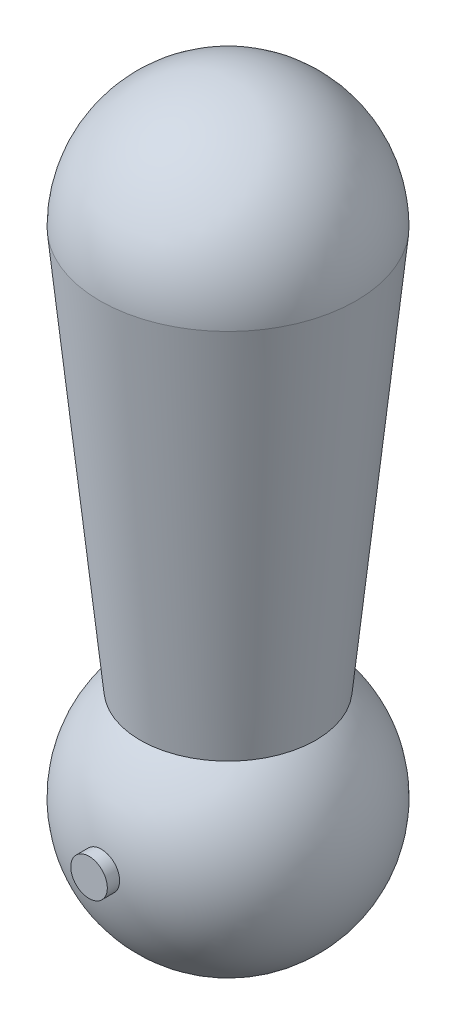
ISO-10303-21;
HEADER;
FILE_DESCRIPTION(('STEP AP214'),'2;1');
FILE_NAME('part.step','',(''),(''),'','','');
FILE_SCHEMA(('AUTOMOTIVE_DESIGN { 1 0 10303 214 1 1 1 1 }'));
ENDSEC;
DATA;
#1=APPLICATION_CONTEXT('core data for automotive mechanical design processes');
#2=APPLICATION_PROTOCOL_DEFINITION('international standard','automotive_design',2000,#1);
#3=PRODUCT_CONTEXT('',#1,'mechanical');
#4=PRODUCT('Part','Part','',(#3));
#5=PRODUCT_RELATED_PRODUCT_CATEGORY('part','',(#4));
#6=PRODUCT_DEFINITION_FORMATION('','',#4);
#7=PRODUCT_DEFINITION_CONTEXT('part definition',#1,'design');
#8=PRODUCT_DEFINITION('design','',#6,#7);
#9=PRODUCT_DEFINITION_SHAPE('','',#8);
#10=(LENGTH_UNIT() NAMED_UNIT(*) SI_UNIT(.MILLI.,.METRE.));
#11=(NAMED_UNIT(*) PLANE_ANGLE_UNIT() SI_UNIT($,.RADIAN.));
#12=(NAMED_UNIT(*) SI_UNIT($,.STERADIAN.) SOLID_ANGLE_UNIT());
#13=UNCERTAINTY_MEASURE_WITH_UNIT(LENGTH_MEASURE(1.E-05),#10,'distance_accuracy_value','');
#14=(GEOMETRIC_REPRESENTATION_CONTEXT(3) GLOBAL_UNCERTAINTY_ASSIGNED_CONTEXT((#13)) GLOBAL_UNIT_ASSIGNED_CONTEXT((#10,
#11,#12)) REPRESENTATION_CONTEXT('',''));
#15=CARTESIAN_POINT('',(0.,0.,0.));
#16=DIRECTION('',(0.,0.,1.));
#17=DIRECTION('',(1.,0.,0.));
#18=AXIS2_PLACEMENT_3D('',#15,#16,#17);
#19=CARTESIAN_POINT('',(0.,0.,0.));
#20=DIRECTION('',(0.,0.,1.));
#21=DIRECTION('',(-1.,0.,0.));
#22=AXIS2_PLACEMENT_3D('',#19,#20,#21);
#23=CYLINDRICAL_SURFACE('',#22,0.25);
#24=CARTESIAN_POINT('',(0.,0.,-1.73205080756888));
#25=DIRECTION('',(0.,0.,1.));
#26=DIRECTION('',(-1.,0.,0.));
#27=AXIS2_PLACEMENT_3D('',#24,#25,#26);
#28=CIRCLE('',#27,0.25);
#29=CARTESIAN_POINT('',(0.25,0.,-1.73205080756888));
#30=VERTEX_POINT('',#29);
#31=CARTESIAN_POINT('',(-0.25,0.,-1.73205080756888));
#32=VERTEX_POINT('',#31);
#33=EDGE_CURVE('E40',#30,#32,#28,.T.);
#34=ORIENTED_EDGE('',*,*,#33,.F.);
#35=DIRECTION('',(0.,0.,-1.));
#36=VECTOR('',#35,1.);
#37=CARTESIAN_POINT('',(0.25,0.,0.));
#38=LINE('',#37,#36);
#39=CARTESIAN_POINT('',(0.25,0.,-1.9));
#40=VERTEX_POINT('',#39);
#41=EDGE_CURVE('E11',#30,#40,#38,.T.);
#42=ORIENTED_EDGE('',*,*,#41,.T.);
#43=CARTESIAN_POINT('',(0.,0.,-1.9));
#44=DIRECTION('',(0.,0.,-1.));
#45=DIRECTION('',(-1.,0.,0.));
#46=AXIS2_PLACEMENT_3D('',#43,#44,#45);
#47=CIRCLE('',#46,0.25);
#48=EDGE_CURVE('E123',#40,#40,#47,.T.);
#49=ORIENTED_EDGE('',*,*,#48,.F.);
#50=ORIENTED_EDGE('',*,*,#41,.F.);
#51=CARTESIAN_POINT('',(0.,0.,-1.73205080756888));
#52=DIRECTION('',(0.,0.,1.));
#53=DIRECTION('',(-1.,0.,0.));
#54=AXIS2_PLACEMENT_3D('',#51,#52,#53);
#55=CIRCLE('',#54,0.25);
#56=EDGE_CURVE('E131',#32,#30,#55,.T.);
#57=ORIENTED_EDGE('',*,*,#56,.F.);
#58=EDGE_LOOP('',(#34,#42,#49,#50,#57));
#59=FACE_BOUND('',#58,.T.);
#60=ADVANCED_FACE('F16',(#59),#23,.T.);
#61=CARTESIAN_POINT('',(0.,0.,0.));
#62=DIRECTION('',(0.,0.,1.));
#63=DIRECTION('',(-1.,0.,0.));
#64=AXIS2_PLACEMENT_3D('',#61,#62,#63);
#65=CYLINDRICAL_SURFACE('',#64,0.25);
#66=CARTESIAN_POINT('',(0.,0.,1.9));
#67=DIRECTION('',(0.,0.,1.));
#68=DIRECTION('',(-1.,0.,0.));
#69=AXIS2_PLACEMENT_3D('',#66,#67,#68);
#70=CIRCLE('',#69,0.25);
#71=CARTESIAN_POINT('',(0.25,0.,1.9));
#72=VERTEX_POINT('',#71);
#73=EDGE_CURVE('E62',#72,#72,#70,.T.);
#74=ORIENTED_EDGE('',*,*,#73,.F.);
#75=DIRECTION('',(0.,0.,-1.));
#76=VECTOR('',#75,1.);
#77=CARTESIAN_POINT('',(0.25,0.,0.));
#78=LINE('',#77,#76);
#79=CARTESIAN_POINT('',(0.25,0.,1.73205080756888));
#80=VERTEX_POINT('',#79);
#81=EDGE_CURVE('E27',#72,#80,#78,.T.);
#82=ORIENTED_EDGE('',*,*,#81,.T.);
#83=CARTESIAN_POINT('',(0.,0.,1.73205080756888));
#84=DIRECTION('',(0.,0.,-1.));
#85=DIRECTION('',(-1.,0.,0.));
#86=AXIS2_PLACEMENT_3D('',#83,#84,#85);
#87=CIRCLE('',#86,0.25);
#88=CARTESIAN_POINT('',(-0.25,0.,1.73205080756888));
#89=VERTEX_POINT('',#88);
#90=EDGE_CURVE('E71',#89,#80,#87,.T.);
#91=ORIENTED_EDGE('',*,*,#90,.F.);
#92=CARTESIAN_POINT('',(0.,0.,1.73205080756888));
#93=DIRECTION('',(0.,0.,-1.));
#94=DIRECTION('',(-1.,0.,0.));
#95=AXIS2_PLACEMENT_3D('',#92,#93,#94);
#96=CIRCLE('',#95,0.25);
#97=EDGE_CURVE('E132',#80,#89,#96,.T.);
#98=ORIENTED_EDGE('',*,*,#97,.F.);
#99=ORIENTED_EDGE('',*,*,#81,.F.);
#100=EDGE_LOOP('',(#74,#82,#91,#98,#99));
#101=FACE_BOUND('',#100,.T.);
#102=ADVANCED_FACE('F168',(#101),#65,.T.);
#103=CARTESIAN_POINT('',(0.,0.,-1.9));
#104=DIRECTION('',(0.,0.,1.));
#105=DIRECTION('',(1.,0.,0.));
#106=AXIS2_PLACEMENT_3D('',#103,#104,#105);
#107=PLANE('',#106);
#108=ORIENTED_EDGE('',*,*,#48,.T.);
#109=EDGE_LOOP('',(#108));
#110=FACE_BOUND('',#109,.T.);
#111=ADVANCED_FACE('F18',(#110),#107,.F.);
#112=CARTESIAN_POINT('',(0.,0.,1.9));
#113=DIRECTION('',(0.,0.,1.));
#114=DIRECTION('',(1.,0.,0.));
#115=AXIS2_PLACEMENT_3D('',#112,#113,#114);
#116=PLANE('',#115);
#117=ORIENTED_EDGE('',*,*,#73,.T.);
#118=EDGE_LOOP('',(#117));
#119=FACE_BOUND('',#118,.T.);
#120=ADVANCED_FACE('F156',(#119),#116,.T.);
#121=CARTESIAN_POINT('',(0.,0.,0.));
#122=DIRECTION('',(0.,0.,1.));
#123=DIRECTION('',(1.,0.,0.));
#124=AXIS2_PLACEMENT_3D('',#121,#122,#123);
#125=SPHERICAL_SURFACE('',#124,1.75);
#126=ORIENTED_EDGE('',*,*,#97,.T.);
#127=CARTESIAN_POINT('',(0.,0.,0.));
#128=DIRECTION('',(0.,-1.,0.));
#129=DIRECTION('',(-1.,0.,0.));
#130=AXIS2_PLACEMENT_3D('',#127,#128,#129);
#131=CIRCLE('',#130,1.75);
#132=EDGE_CURVE('E134',#89,#32,#131,.T.);
#133=ORIENTED_EDGE('',*,*,#132,.T.);
#134=ORIENTED_EDGE('',*,*,#56,.T.);
#135=ORIENTED_EDGE('',*,*,#33,.T.);
#136=ORIENTED_EDGE('',*,*,#132,.F.);
#137=ORIENTED_EDGE('',*,*,#90,.T.);
#138=EDGE_LOOP('',(#126,#133,#134,#135,#136,#137));
#139=FACE_BOUND('',#138,.T.);
#140=CARTESIAN_POINT('',(0.,1.2737739202857,0.));
#141=DIRECTION('',(0.,1.,0.));
#142=DIRECTION('',(1.,0.,0.));
#143=AXIS2_PLACEMENT_3D('',#140,#141,#142);
#144=CIRCLE('',#143,1.2);
#145=CARTESIAN_POINT('',(-1.2,1.2737739202857,0.));
#146=VERTEX_POINT('',#145);
#147=CARTESIAN_POINT('',(1.2,1.2737739202857,0.));
#148=VERTEX_POINT('',#147);
#149=EDGE_CURVE('E83',#146,#148,#144,.T.);
#150=ORIENTED_EDGE('',*,*,#149,.F.);
#151=CARTESIAN_POINT('',(0.,1.2737739202857,0.));
#152=DIRECTION('',(0.,1.,0.));
#153=DIRECTION('',(1.,0.,0.));
#154=AXIS2_PLACEMENT_3D('',#151,#152,#153);
#155=CIRCLE('',#154,1.2);
#156=EDGE_CURVE('E128',#148,#146,#155,.T.);
#157=ORIENTED_EDGE('',*,*,#156,.F.);
#158=EDGE_LOOP('',(#150,#157));
#159=FACE_BOUND('',#158,.T.);
#160=ADVANCED_FACE('F154',(#139,#159),#125,.T.);
#161=CARTESIAN_POINT('',(0.,4.01188696014285,0.));
#162=DIRECTION('',(0.,1.,0.));
#163=DIRECTION('',(-1.,0.,0.));
#164=AXIS2_PLACEMENT_3D('',#161,#162,#163);
#165=CONICAL_SURFACE('',#164,1.475,0.100098465311667);
#166=CARTESIAN_POINT('',(0.,6.75,0.));
#167=DIRECTION('',(0.,1.,0.));
#168=DIRECTION('',(1.,0.,0.));
#169=AXIS2_PLACEMENT_3D('',#166,#167,#168);
#170=CIRCLE('',#169,1.75);
#171=CARTESIAN_POINT('',(-1.75,6.75,0.));
#172=VERTEX_POINT('',#171);
#173=CARTESIAN_POINT('',(0.,6.75,1.75));
#174=VERTEX_POINT('',#173);
#175=EDGE_CURVE('E98',#172,#174,#170,.T.);
#176=ORIENTED_EDGE('',*,*,#175,.F.);
#177=CARTESIAN_POINT('',(0.,6.75,0.));
#178=DIRECTION('',(0.,1.,0.));
#179=DIRECTION('',(1.,0.,0.));
#180=AXIS2_PLACEMENT_3D('',#177,#178,#179);
#181=CIRCLE('',#180,1.75);
#182=CARTESIAN_POINT('',(1.75,6.75,0.));
#183=VERTEX_POINT('',#182);
#184=EDGE_CURVE('E20',#183,#172,#181,.T.);
#185=ORIENTED_EDGE('',*,*,#184,.F.);
#186=DIRECTION('',(-0.0999313895579502,-0.994994330326066,0.));
#187=VECTOR('',#186,1.);
#188=CARTESIAN_POINT('',(1.475,4.01188696014285,0.));
#189=LINE('',#188,#187);
#190=EDGE_CURVE('E140',#183,#148,#189,.T.);
#191=ORIENTED_EDGE('',*,*,#190,.T.);
#192=ORIENTED_EDGE('',*,*,#156,.T.);
#193=ORIENTED_EDGE('',*,*,#149,.T.);
#194=ORIENTED_EDGE('',*,*,#190,.F.);
#195=CARTESIAN_POINT('',(0.,6.75,0.));
#196=DIRECTION('',(0.,1.,0.));
#197=DIRECTION('',(1.,0.,0.));
#198=AXIS2_PLACEMENT_3D('',#195,#196,#197);
#199=CIRCLE('',#198,1.75);
#200=EDGE_CURVE('E107',#174,#183,#199,.T.);
#201=ORIENTED_EDGE('',*,*,#200,.F.);
#202=EDGE_LOOP('',(#176,#185,#191,#192,#193,#194,#201));
#203=FACE_BOUND('',#202,.T.);
#204=ADVANCED_FACE('F153',(#203),#165,.T.);
#205=CARTESIAN_POINT('',(0.,6.75,0.));
#206=DIRECTION('',(0.,1.,0.));
#207=DIRECTION('',(0.,0.,-1.));
#208=AXIS2_PLACEMENT_3D('',#205,#206,#207);
#209=SPHERICAL_SURFACE('',#208,1.75);
#210=ORIENTED_EDGE('',*,*,#175,.T.);
#211=CARTESIAN_POINT('',(0.,6.75,0.));
#212=DIRECTION('',(1.,0.,0.));
#213=DIRECTION('',(0.,0.,1.));
#214=AXIS2_PLACEMENT_3D('',#211,#212,#213);
#215=CIRCLE('',#214,1.75);
#216=CARTESIAN_POINT('',(0.,8.5,0.));
#217=VERTEX_POINT('',#216);
#218=EDGE_CURVE('E112',#217,#174,#215,.T.);
#219=ORIENTED_EDGE('',*,*,#218,.F.);
#220=ORIENTED_EDGE('',*,*,#218,.T.);
#221=ORIENTED_EDGE('',*,*,#200,.T.);
#222=ORIENTED_EDGE('',*,*,#184,.T.);
#223=EDGE_LOOP('',(#210,#219,#220,#221,#222));
#224=FACE_BOUND('',#223,.T.);
#225=ADVANCED_FACE('F113',(#224),#209,.T.);
#226=CLOSED_SHELL('',(#60,#102,#111,#120,#160,#204,#225));
#227=MANIFOLD_SOLID_BREP('B1',#226);
#228=ADVANCED_BREP_SHAPE_REPRESENTATION('',(#18,#227),#14);
#229=SHAPE_DEFINITION_REPRESENTATION(#9,#228);
ENDSEC;
END-ISO-10303-21;
